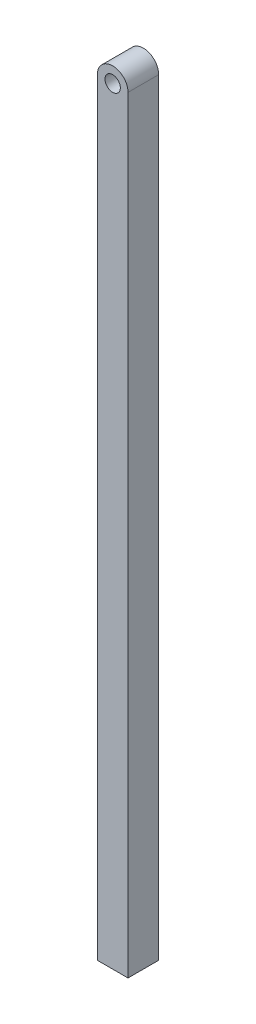
ISO-10303-21;
HEADER;
FILE_DESCRIPTION(('STEP AP214'),'2;1');
FILE_NAME('part.step','',(''),(''),'','','');
FILE_SCHEMA(('AUTOMOTIVE_DESIGN { 1 0 10303 214 1 1 1 1 }'));
ENDSEC;
DATA;
#1=APPLICATION_CONTEXT('core data for automotive mechanical design processes');
#2=APPLICATION_PROTOCOL_DEFINITION('international standard','automotive_design',2000,#1);
#3=PRODUCT_CONTEXT('',#1,'mechanical');
#4=PRODUCT('Part','Part','',(#3));
#5=PRODUCT_RELATED_PRODUCT_CATEGORY('part','',(#4));
#6=PRODUCT_DEFINITION_FORMATION('','',#4);
#7=PRODUCT_DEFINITION_CONTEXT('part definition',#1,'design');
#8=PRODUCT_DEFINITION('design','',#6,#7);
#9=PRODUCT_DEFINITION_SHAPE('','',#8);
#10=(LENGTH_UNIT() NAMED_UNIT(*) SI_UNIT(.MILLI.,.METRE.));
#11=(NAMED_UNIT(*) PLANE_ANGLE_UNIT() SI_UNIT($,.RADIAN.));
#12=(NAMED_UNIT(*) SI_UNIT($,.STERADIAN.) SOLID_ANGLE_UNIT());
#13=UNCERTAINTY_MEASURE_WITH_UNIT(LENGTH_MEASURE(1.E-05),#10,'distance_accuracy_value','');
#14=(GEOMETRIC_REPRESENTATION_CONTEXT(3) GLOBAL_UNCERTAINTY_ASSIGNED_CONTEXT((#13)) GLOBAL_UNIT_ASSIGNED_CONTEXT((#10,
#11,#12)) REPRESENTATION_CONTEXT('',''));
#15=CARTESIAN_POINT('',(0.,0.,0.));
#16=DIRECTION('',(0.,0.,1.));
#17=DIRECTION('',(1.,0.,0.));
#18=AXIS2_PLACEMENT_3D('',#15,#16,#17);
#19=CARTESIAN_POINT('',(0.,0.,25.4));
#20=DIRECTION('',(0.,0.,1.));
#21=DIRECTION('',(1.,0.,0.));
#22=AXIS2_PLACEMENT_3D('',#19,#20,#21);
#23=PLANE('',#22);
#24=CARTESIAN_POINT('',(0.,0.,25.4));
#25=DIRECTION('',(0.,0.,1.));
#26=DIRECTION('',(1.,0.,0.));
#27=AXIS2_PLACEMENT_3D('',#24,#25,#26);
#28=CIRCLE('',#27,12.7);
#29=CARTESIAN_POINT('',(12.7,0.,25.4));
#30=VERTEX_POINT('',#29);
#31=CARTESIAN_POINT('',(-12.7,0.,25.4));
#32=VERTEX_POINT('',#31);
#33=EDGE_CURVE('E94',#30,#32,#28,.T.);
#34=ORIENTED_EDGE('',*,*,#33,.T.);
#35=DIRECTION('',(0.,-1.,0.));
#36=VECTOR('',#35,1.);
#37=CARTESIAN_POINT('',(-12.7,0.,25.4));
#38=LINE('',#37,#36);
#39=CARTESIAN_POINT('',(-12.6999999999999,-635.,25.4));
#40=VERTEX_POINT('',#39);
#41=EDGE_CURVE('E89',#32,#40,#38,.T.);
#42=ORIENTED_EDGE('',*,*,#41,.T.);
#43=DIRECTION('',(1.,0.,0.));
#44=VECTOR('',#43,1.);
#45=CARTESIAN_POINT('',(-12.6999999999999,-635.,25.4));
#46=LINE('',#45,#44);
#47=CARTESIAN_POINT('',(12.6999999999999,-635.,25.4));
#48=VERTEX_POINT('',#47);
#49=EDGE_CURVE('E92',#40,#48,#46,.T.);
#50=ORIENTED_EDGE('',*,*,#49,.T.);
#51=DIRECTION('',(0.,1.,0.));
#52=VECTOR('',#51,1.);
#53=CARTESIAN_POINT('',(12.6999999999999,-635.,25.4));
#54=LINE('',#53,#52);
#55=EDGE_CURVE('E59',#48,#30,#54,.T.);
#56=ORIENTED_EDGE('',*,*,#55,.T.);
#57=EDGE_LOOP('',(#34,#42,#50,#56));
#58=FACE_BOUND('',#57,.T.);
#59=CARTESIAN_POINT('',(0.,0.,25.4));
#60=DIRECTION('',(0.,0.,1.));
#61=DIRECTION('',(1.,0.,0.));
#62=AXIS2_PLACEMENT_3D('',#59,#60,#61);
#63=CIRCLE('',#62,6.35);
#64=CARTESIAN_POINT('',(6.35,0.,25.4));
#65=VERTEX_POINT('',#64);
#66=EDGE_CURVE('E109',#65,#65,#63,.T.);
#67=ORIENTED_EDGE('',*,*,#66,.F.);
#68=EDGE_LOOP('',(#67));
#69=FACE_BOUND('',#68,.T.);
#70=ADVANCED_FACE('F42',(#58,#69),#23,.T.);
#71=CARTESIAN_POINT('',(0.,0.,0.));
#72=DIRECTION('',(0.,0.,1.));
#73=DIRECTION('',(1.,0.,0.));
#74=AXIS2_PLACEMENT_3D('',#71,#72,#73);
#75=PLANE('',#74);
#76=CARTESIAN_POINT('',(0.,0.,0.));
#77=DIRECTION('',(0.,0.,1.));
#78=DIRECTION('',(1.,0.,0.));
#79=AXIS2_PLACEMENT_3D('',#76,#77,#78);
#80=CIRCLE('',#79,12.7);
#81=CARTESIAN_POINT('',(12.7,0.,0.));
#82=VERTEX_POINT('',#81);
#83=CARTESIAN_POINT('',(-12.7,0.,0.));
#84=VERTEX_POINT('',#83);
#85=EDGE_CURVE('E106',#82,#84,#80,.T.);
#86=ORIENTED_EDGE('',*,*,#85,.F.);
#87=DIRECTION('',(0.,1.,0.));
#88=VECTOR('',#87,1.);
#89=CARTESIAN_POINT('',(12.6999999999999,-635.,0.));
#90=LINE('',#89,#88);
#91=CARTESIAN_POINT('',(12.6999999999999,-635.,0.));
#92=VERTEX_POINT('',#91);
#93=EDGE_CURVE('E82',#92,#82,#90,.T.);
#94=ORIENTED_EDGE('',*,*,#93,.F.);
#95=DIRECTION('',(1.,0.,0.));
#96=VECTOR('',#95,1.);
#97=CARTESIAN_POINT('',(-12.6999999999999,-635.,0.));
#98=LINE('',#97,#96);
#99=CARTESIAN_POINT('',(-12.6999999999999,-635.,0.));
#100=VERTEX_POINT('',#99);
#101=EDGE_CURVE('E76',#100,#92,#98,.T.);
#102=ORIENTED_EDGE('',*,*,#101,.F.);
#103=DIRECTION('',(0.,-1.,0.));
#104=VECTOR('',#103,1.);
#105=CARTESIAN_POINT('',(-12.7,0.,0.));
#106=LINE('',#105,#104);
#107=EDGE_CURVE('E98',#84,#100,#106,.T.);
#108=ORIENTED_EDGE('',*,*,#107,.F.);
#109=EDGE_LOOP('',(#86,#94,#102,#108));
#110=FACE_BOUND('',#109,.T.);
#111=CARTESIAN_POINT('',(0.,0.,0.));
#112=DIRECTION('',(0.,0.,1.));
#113=DIRECTION('',(1.,0.,0.));
#114=AXIS2_PLACEMENT_3D('',#111,#112,#113);
#115=CIRCLE('',#114,6.35);
#116=CARTESIAN_POINT('',(6.35,0.,0.));
#117=VERTEX_POINT('',#116);
#118=EDGE_CURVE('E121',#117,#117,#115,.T.);
#119=ORIENTED_EDGE('',*,*,#118,.T.);
#120=EDGE_LOOP('',(#119));
#121=FACE_BOUND('',#120,.T.);
#122=ADVANCED_FACE('F117',(#110,#121),#75,.F.);
#123=CARTESIAN_POINT('',(0.,0.,25.4));
#124=DIRECTION('',(0.,0.,-1.));
#125=DIRECTION('',(-1.,0.,0.));
#126=AXIS2_PLACEMENT_3D('',#123,#124,#125);
#127=CYLINDRICAL_SURFACE('',#126,12.7);
#128=ORIENTED_EDGE('',*,*,#85,.T.);
#129=DIRECTION('',(0.,0.,-1.));
#130=VECTOR('',#129,1.);
#131=CARTESIAN_POINT('',(-12.7,0.,25.4));
#132=LINE('',#131,#130);
#133=EDGE_CURVE('E11',#32,#84,#132,.T.);
#134=ORIENTED_EDGE('',*,*,#133,.F.);
#135=ORIENTED_EDGE('',*,*,#33,.F.);
#136=DIRECTION('',(0.,0.,-1.));
#137=VECTOR('',#136,1.);
#138=CARTESIAN_POINT('',(12.7,0.,25.4));
#139=LINE('',#138,#137);
#140=EDGE_CURVE('E102',#30,#82,#139,.T.);
#141=ORIENTED_EDGE('',*,*,#140,.T.);
#142=EDGE_LOOP('',(#128,#134,#135,#141));
#143=FACE_BOUND('',#142,.T.);
#144=ADVANCED_FACE('F44',(#143),#127,.T.);
#145=CARTESIAN_POINT('',(-12.7,0.,25.4));
#146=DIRECTION('',(1.,0.,0.));
#147=DIRECTION('',(0.,1.,0.));
#148=AXIS2_PLACEMENT_3D('',#145,#146,#147);
#149=PLANE('',#148);
#150=ORIENTED_EDGE('',*,*,#107,.T.);
#151=DIRECTION('',(0.,0.,-1.));
#152=VECTOR('',#151,1.);
#153=CARTESIAN_POINT('',(-12.6999999999999,-635.,25.4));
#154=LINE('',#153,#152);
#155=EDGE_CURVE('E51',#40,#100,#154,.T.);
#156=ORIENTED_EDGE('',*,*,#155,.F.);
#157=ORIENTED_EDGE('',*,*,#41,.F.);
#158=ORIENTED_EDGE('',*,*,#133,.T.);
#159=EDGE_LOOP('',(#150,#156,#157,#158));
#160=FACE_BOUND('',#159,.T.);
#161=ADVANCED_FACE('F97',(#160),#149,.F.);
#162=CARTESIAN_POINT('',(-12.6999999999999,-635.,25.4));
#163=DIRECTION('',(0.,1.,0.));
#164=DIRECTION('',(0.,0.,1.));
#165=AXIS2_PLACEMENT_3D('',#162,#163,#164);
#166=PLANE('',#165);
#167=ORIENTED_EDGE('',*,*,#101,.T.);
#168=DIRECTION('',(0.,0.,-1.));
#169=VECTOR('',#168,1.);
#170=CARTESIAN_POINT('',(12.6999999999999,-635.,25.4));
#171=LINE('',#170,#169);
#172=EDGE_CURVE('E99',#48,#92,#171,.T.);
#173=ORIENTED_EDGE('',*,*,#172,.F.);
#174=ORIENTED_EDGE('',*,*,#49,.F.);
#175=ORIENTED_EDGE('',*,*,#155,.T.);
#176=EDGE_LOOP('',(#167,#173,#174,#175));
#177=FACE_BOUND('',#176,.T.);
#178=ADVANCED_FACE('F100',(#177),#166,.F.);
#179=CARTESIAN_POINT('',(12.6999999999999,-635.,25.4));
#180=DIRECTION('',(-1.,0.,0.));
#181=DIRECTION('',(0.,-1.,0.));
#182=AXIS2_PLACEMENT_3D('',#179,#180,#181);
#183=PLANE('',#182);
#184=ORIENTED_EDGE('',*,*,#93,.T.);
#185=ORIENTED_EDGE('',*,*,#140,.F.);
#186=ORIENTED_EDGE('',*,*,#55,.F.);
#187=ORIENTED_EDGE('',*,*,#172,.T.);
#188=EDGE_LOOP('',(#184,#185,#186,#187));
#189=FACE_BOUND('',#188,.T.);
#190=ADVANCED_FACE('F114',(#189),#183,.F.);
#191=CARTESIAN_POINT('',(0.,0.,25.4));
#192=DIRECTION('',(0.,0.,-1.));
#193=DIRECTION('',(-1.,0.,0.));
#194=AXIS2_PLACEMENT_3D('',#191,#192,#193);
#195=CYLINDRICAL_SURFACE('',#194,6.35);
#196=ORIENTED_EDGE('',*,*,#66,.T.);
#197=EDGE_LOOP('',(#196));
#198=FACE_BOUND('',#197,.T.);
#199=ORIENTED_EDGE('',*,*,#118,.F.);
#200=EDGE_LOOP('',(#199));
#201=FACE_BOUND('',#200,.T.);
#202=ADVANCED_FACE('F127',(#198,#201),#195,.F.);
#203=CLOSED_SHELL('',(#70,#122,#144,#161,#178,#190,#202));
#204=MANIFOLD_SOLID_BREP('B2',#203);
#205=ADVANCED_BREP_SHAPE_REPRESENTATION('',(#18,#204),#14);
#206=SHAPE_DEFINITION_REPRESENTATION(#9,#205);
ENDSEC;
END-ISO-10303-21;
